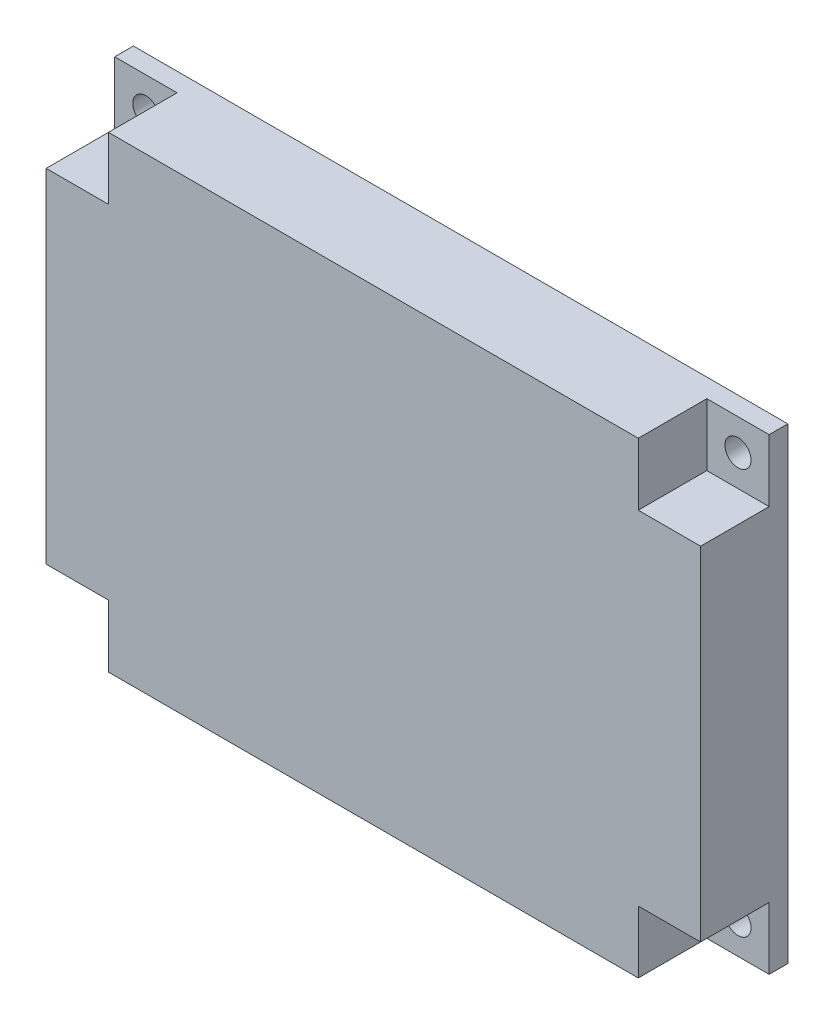
ISO-10303-21;
HEADER;
FILE_DESCRIPTION(('STEP AP214'),'2;1');
FILE_NAME('part.step','',(''),(''),'','','');
FILE_SCHEMA(('AUTOMOTIVE_DESIGN { 1 0 10303 214 1 1 1 1 }'));
ENDSEC;
DATA;
#1=APPLICATION_CONTEXT('core data for automotive mechanical design processes');
#2=APPLICATION_PROTOCOL_DEFINITION('international standard','automotive_design',2000,#1);
#3=PRODUCT_CONTEXT('',#1,'mechanical');
#4=PRODUCT('Part','Part','',(#3));
#5=PRODUCT_RELATED_PRODUCT_CATEGORY('part','',(#4));
#6=PRODUCT_DEFINITION_FORMATION('','',#4);
#7=PRODUCT_DEFINITION_CONTEXT('part definition',#1,'design');
#8=PRODUCT_DEFINITION('design','',#6,#7);
#9=PRODUCT_DEFINITION_SHAPE('','',#8);
#10=(LENGTH_UNIT() NAMED_UNIT(*) SI_UNIT(.MILLI.,.METRE.));
#11=(NAMED_UNIT(*) PLANE_ANGLE_UNIT() SI_UNIT($,.RADIAN.));
#12=(NAMED_UNIT(*) SI_UNIT($,.STERADIAN.) SOLID_ANGLE_UNIT());
#13=UNCERTAINTY_MEASURE_WITH_UNIT(LENGTH_MEASURE(1.E-05),#10,'distance_accuracy_value','');
#14=(GEOMETRIC_REPRESENTATION_CONTEXT(3) GLOBAL_UNCERTAINTY_ASSIGNED_CONTEXT((#13)) GLOBAL_UNIT_ASSIGNED_CONTEXT((#10,
#11,#12)) REPRESENTATION_CONTEXT('',''));
#15=CARTESIAN_POINT('',(0.,0.,0.));
#16=DIRECTION('',(0.,0.,1.));
#17=DIRECTION('',(1.,0.,0.));
#18=AXIS2_PLACEMENT_3D('',#15,#16,#17);
#19=CARTESIAN_POINT('',(-47.5,32.5,14.));
#20=DIRECTION('',(0.,0.,-1.));
#21=DIRECTION('',(-1.,0.,0.));
#22=AXIS2_PLACEMENT_3D('',#19,#20,#21);
#23=CYLINDRICAL_SURFACE('',#22,2.1);
#24=CARTESIAN_POINT('',(-47.5,32.5,0.));
#25=DIRECTION('',(0.,0.,1.));
#26=DIRECTION('',(-1.,0.,0.));
#27=AXIS2_PLACEMENT_3D('',#24,#25,#26);
#28=CIRCLE('',#27,2.1);
#29=CARTESIAN_POINT('',(-49.6,32.5,0.));
#30=VERTEX_POINT('',#29);
#31=EDGE_CURVE('E250',#30,#30,#28,.T.);
#32=ORIENTED_EDGE('',*,*,#31,.F.);
#33=EDGE_LOOP('',(#32));
#34=FACE_BOUND('',#33,.T.);
#35=CARTESIAN_POINT('',(-47.5,32.5,3.));
#36=DIRECTION('',(0.,0.,1.));
#37=DIRECTION('',(1.,0.,0.));
#38=AXIS2_PLACEMENT_3D('',#35,#36,#37);
#39=CIRCLE('',#38,2.1);
#40=CARTESIAN_POINT('',(-45.4,32.5,3.));
#41=VERTEX_POINT('',#40);
#42=EDGE_CURVE('E287',#41,#41,#39,.T.);
#43=ORIENTED_EDGE('',*,*,#42,.T.);
#44=EDGE_LOOP('',(#43));
#45=FACE_BOUND('',#44,.T.);
#46=ADVANCED_FACE('F32',(#34,#45),#23,.F.);
#47=CARTESIAN_POINT('',(-47.5,-32.5,14.));
#48=DIRECTION('',(0.,0.,-1.));
#49=DIRECTION('',(-1.,0.,0.));
#50=AXIS2_PLACEMENT_3D('',#47,#48,#49);
#51=CYLINDRICAL_SURFACE('',#50,2.1);
#52=CARTESIAN_POINT('',(-47.5,-32.5,0.));
#53=DIRECTION('',(0.,0.,1.));
#54=DIRECTION('',(1.,0.,0.));
#55=AXIS2_PLACEMENT_3D('',#52,#53,#54);
#56=CIRCLE('',#55,2.1);
#57=CARTESIAN_POINT('',(-45.4,-32.5,0.));
#58=VERTEX_POINT('',#57);
#59=EDGE_CURVE('E244',#58,#58,#56,.T.);
#60=ORIENTED_EDGE('',*,*,#59,.F.);
#61=EDGE_LOOP('',(#60));
#62=FACE_BOUND('',#61,.T.);
#63=CARTESIAN_POINT('',(-47.5,-32.5,3.));
#64=DIRECTION('',(0.,0.,1.));
#65=DIRECTION('',(1.,0.,0.));
#66=AXIS2_PLACEMENT_3D('',#63,#64,#65);
#67=CIRCLE('',#66,2.1);
#68=CARTESIAN_POINT('',(-45.4,-32.5,3.));
#69=VERTEX_POINT('',#68);
#70=EDGE_CURVE('E240',#69,#69,#67,.T.);
#71=ORIENTED_EDGE('',*,*,#70,.T.);
#72=EDGE_LOOP('',(#71));
#73=FACE_BOUND('',#72,.T.);
#74=ADVANCED_FACE('F316',(#62,#73),#51,.F.);
#75=CARTESIAN_POINT('',(0.,0.,14.));
#76=DIRECTION('',(0.,0.,1.));
#77=DIRECTION('',(1.,0.,0.));
#78=AXIS2_PLACEMENT_3D('',#75,#76,#77);
#79=PLANE('',#78);
#80=DIRECTION('',(-1.,0.,0.));
#81=VECTOR('',#80,1.);
#82=CARTESIAN_POINT('',(42.5,-27.5,14.));
#83=LINE('',#82,#81);
#84=CARTESIAN_POINT('',(52.5,-27.5,14.));
#85=VERTEX_POINT('',#84);
#86=CARTESIAN_POINT('',(42.5,-27.5,14.));
#87=VERTEX_POINT('',#86);
#88=EDGE_CURVE('E215',#85,#87,#83,.T.);
#89=ORIENTED_EDGE('',*,*,#88,.F.);
#90=DIRECTION('',(0.,1.,0.));
#91=VECTOR('',#90,1.);
#92=CARTESIAN_POINT('',(52.5,37.5,14.));
#93=LINE('',#92,#91);
#94=CARTESIAN_POINT('',(52.5,27.5,14.));
#95=VERTEX_POINT('',#94);
#96=EDGE_CURVE('E257',#85,#95,#93,.T.);
#97=ORIENTED_EDGE('',*,*,#96,.T.);
#98=DIRECTION('',(1.,0.,0.));
#99=VECTOR('',#98,1.);
#100=CARTESIAN_POINT('',(42.5,27.5,14.));
#101=LINE('',#100,#99);
#102=CARTESIAN_POINT('',(42.5,27.5,14.));
#103=VERTEX_POINT('',#102);
#104=EDGE_CURVE('E226',#103,#95,#101,.T.);
#105=ORIENTED_EDGE('',*,*,#104,.F.);
#106=DIRECTION('',(0.,-1.,0.));
#107=VECTOR('',#106,1.);
#108=CARTESIAN_POINT('',(42.5,27.5,14.));
#109=LINE('',#108,#107);
#110=CARTESIAN_POINT('',(42.5,37.5,14.));
#111=VERTEX_POINT('',#110);
#112=EDGE_CURVE('E179',#111,#103,#109,.T.);
#113=ORIENTED_EDGE('',*,*,#112,.F.);
#114=DIRECTION('',(-1.,0.,0.));
#115=VECTOR('',#114,1.);
#116=CARTESIAN_POINT('',(-52.5,37.5,14.));
#117=LINE('',#116,#115);
#118=CARTESIAN_POINT('',(-42.5,37.5,14.));
#119=VERTEX_POINT('',#118);
#120=EDGE_CURVE('E260',#111,#119,#117,.T.);
#121=ORIENTED_EDGE('',*,*,#120,.T.);
#122=DIRECTION('',(0.,1.,0.));
#123=VECTOR('',#122,1.);
#124=CARTESIAN_POINT('',(-42.5,27.5,14.));
#125=LINE('',#124,#123);
#126=CARTESIAN_POINT('',(-42.5,27.5,14.));
#127=VERTEX_POINT('',#126);
#128=EDGE_CURVE('E154',#127,#119,#125,.T.);
#129=ORIENTED_EDGE('',*,*,#128,.F.);
#130=DIRECTION('',(1.,0.,0.));
#131=VECTOR('',#130,1.);
#132=CARTESIAN_POINT('',(-42.5,27.5,14.));
#133=LINE('',#132,#131);
#134=CARTESIAN_POINT('',(-52.5,27.5,14.));
#135=VERTEX_POINT('',#134);
#136=EDGE_CURVE('E163',#135,#127,#133,.T.);
#137=ORIENTED_EDGE('',*,*,#136,.F.);
#138=DIRECTION('',(0.,-1.,0.));
#139=VECTOR('',#138,1.);
#140=CARTESIAN_POINT('',(-52.5,37.5,14.));
#141=LINE('',#140,#139);
#142=CARTESIAN_POINT('',(-52.5,-27.5,14.));
#143=VERTEX_POINT('',#142);
#144=EDGE_CURVE('E263',#135,#143,#141,.T.);
#145=ORIENTED_EDGE('',*,*,#144,.T.);
#146=DIRECTION('',(-1.,0.,0.));
#147=VECTOR('',#146,1.);
#148=CARTESIAN_POINT('',(-42.5,-27.5,14.));
#149=LINE('',#148,#147);
#150=CARTESIAN_POINT('',(-42.5,-27.5,14.));
#151=VERTEX_POINT('',#150);
#152=EDGE_CURVE('E193',#151,#143,#149,.T.);
#153=ORIENTED_EDGE('',*,*,#152,.F.);
#154=DIRECTION('',(0.,1.,0.));
#155=VECTOR('',#154,1.);
#156=CARTESIAN_POINT('',(-42.5,-27.5,14.));
#157=LINE('',#156,#155);
#158=CARTESIAN_POINT('',(-42.5,-37.5,14.));
#159=VERTEX_POINT('',#158);
#160=EDGE_CURVE('E185',#159,#151,#157,.T.);
#161=ORIENTED_EDGE('',*,*,#160,.F.);
#162=DIRECTION('',(1.,0.,0.));
#163=VECTOR('',#162,1.);
#164=CARTESIAN_POINT('',(-52.5,-37.5,14.));
#165=LINE('',#164,#163);
#166=CARTESIAN_POINT('',(42.5,-37.5,14.));
#167=VERTEX_POINT('',#166);
#168=EDGE_CURVE('E266',#159,#167,#165,.T.);
#169=ORIENTED_EDGE('',*,*,#168,.T.);
#170=DIRECTION('',(0.,-1.,0.));
#171=VECTOR('',#170,1.);
#172=CARTESIAN_POINT('',(42.5,-27.5,14.));
#173=LINE('',#172,#171);
#174=EDGE_CURVE('E207',#87,#167,#173,.T.);
#175=ORIENTED_EDGE('',*,*,#174,.F.);
#176=EDGE_LOOP('',(#89,#97,#105,#113,#121,#129,#137,#145,#153,#161,#169,#175));
#177=FACE_BOUND('',#176,.T.);
#178=ADVANCED_FACE('F307',(#177),#79,.T.);
#179=CARTESIAN_POINT('',(0.,0.,0.));
#180=DIRECTION('',(0.,0.,1.));
#181=DIRECTION('',(1.,0.,0.));
#182=AXIS2_PLACEMENT_3D('',#179,#180,#181);
#183=PLANE('',#182);
#184=DIRECTION('',(0.,1.,0.));
#185=VECTOR('',#184,1.);
#186=CARTESIAN_POINT('',(52.5,37.5,0.));
#187=LINE('',#186,#185);
#188=CARTESIAN_POINT('',(52.5,-37.5,0.));
#189=VERTEX_POINT('',#188);
#190=CARTESIAN_POINT('',(52.5,37.5,0.));
#191=VERTEX_POINT('',#190);
#192=EDGE_CURVE('E256',#189,#191,#187,.T.);
#193=ORIENTED_EDGE('',*,*,#192,.F.);
#194=DIRECTION('',(1.,0.,0.));
#195=VECTOR('',#194,1.);
#196=CARTESIAN_POINT('',(-52.5,-37.5,0.));
#197=LINE('',#196,#195);
#198=CARTESIAN_POINT('',(-52.5,-37.5,0.));
#199=VERTEX_POINT('',#198);
#200=EDGE_CURVE('E261',#199,#189,#197,.T.);
#201=ORIENTED_EDGE('',*,*,#200,.F.);
#202=DIRECTION('',(0.,-1.,0.));
#203=VECTOR('',#202,1.);
#204=CARTESIAN_POINT('',(-52.5,37.5,0.));
#205=LINE('',#204,#203);
#206=CARTESIAN_POINT('',(-52.5,37.5,0.));
#207=VERTEX_POINT('',#206);
#208=EDGE_CURVE('E274',#207,#199,#205,.T.);
#209=ORIENTED_EDGE('',*,*,#208,.F.);
#210=DIRECTION('',(-1.,0.,0.));
#211=VECTOR('',#210,1.);
#212=CARTESIAN_POINT('',(-52.5,37.5,0.));
#213=LINE('',#212,#211);
#214=EDGE_CURVE('E272',#191,#207,#213,.T.);
#215=ORIENTED_EDGE('',*,*,#214,.F.);
#216=EDGE_LOOP('',(#193,#201,#209,#215));
#217=FACE_BOUND('',#216,.T.);
#218=CARTESIAN_POINT('',(47.5,32.5,0.));
#219=DIRECTION('',(0.,0.,1.));
#220=DIRECTION('',(1.,0.,0.));
#221=AXIS2_PLACEMENT_3D('',#218,#219,#220);
#222=CIRCLE('',#221,2.1);
#223=CARTESIAN_POINT('',(49.6,32.5,0.));
#224=VERTEX_POINT('',#223);
#225=EDGE_CURVE('E253',#224,#224,#222,.T.);
#226=ORIENTED_EDGE('',*,*,#225,.T.);
#227=EDGE_LOOP('',(#226));
#228=FACE_BOUND('',#227,.T.);
#229=ORIENTED_EDGE('',*,*,#31,.T.);
#230=EDGE_LOOP('',(#229));
#231=FACE_BOUND('',#230,.T.);
#232=CARTESIAN_POINT('',(47.5,-32.5,0.));
#233=DIRECTION('',(0.,0.,1.));
#234=DIRECTION('',(-1.,0.,0.));
#235=AXIS2_PLACEMENT_3D('',#232,#233,#234);
#236=CIRCLE('',#235,2.1);
#237=CARTESIAN_POINT('',(45.4,-32.5,0.));
#238=VERTEX_POINT('',#237);
#239=EDGE_CURVE('E247',#238,#238,#236,.T.);
#240=ORIENTED_EDGE('',*,*,#239,.T.);
#241=EDGE_LOOP('',(#240));
#242=FACE_BOUND('',#241,.T.);
#243=ORIENTED_EDGE('',*,*,#59,.T.);
#244=EDGE_LOOP('',(#243));
#245=FACE_BOUND('',#244,.T.);
#246=ADVANCED_FACE('F304',(#217,#228,#231,#242,#245),#183,.F.);
#247=CARTESIAN_POINT('',(52.5,37.5,14.));
#248=DIRECTION('',(-1.,0.,0.));
#249=DIRECTION('',(0.,0.,1.));
#250=AXIS2_PLACEMENT_3D('',#247,#248,#249);
#251=PLANE('',#250);
#252=ORIENTED_EDGE('',*,*,#96,.F.);
#253=DIRECTION('',(0.,0.,1.));
#254=VECTOR('',#253,1.);
#255=CARTESIAN_POINT('',(52.5,-27.5,3.));
#256=LINE('',#255,#254);
#257=CARTESIAN_POINT('',(52.5,-27.5,3.));
#258=VERTEX_POINT('',#257);
#259=EDGE_CURVE('E195',#258,#85,#256,.T.);
#260=ORIENTED_EDGE('',*,*,#259,.F.);
#261=DIRECTION('',(0.,1.,0.));
#262=VECTOR('',#261,1.);
#263=CARTESIAN_POINT('',(52.5,-27.5,3.));
#264=LINE('',#263,#262);
#265=CARTESIAN_POINT('',(52.5,-37.5,3.));
#266=VERTEX_POINT('',#265);
#267=EDGE_CURVE('E211',#266,#258,#264,.T.);
#268=ORIENTED_EDGE('',*,*,#267,.F.);
#269=DIRECTION('',(0.,0.,-1.));
#270=VECTOR('',#269,1.);
#271=CARTESIAN_POINT('',(52.5,-37.5,14.));
#272=LINE('',#271,#270);
#273=EDGE_CURVE('E269',#266,#189,#272,.T.);
#274=ORIENTED_EDGE('',*,*,#273,.T.);
#275=ORIENTED_EDGE('',*,*,#192,.T.);
#276=DIRECTION('',(0.,0.,-1.));
#277=VECTOR('',#276,1.);
#278=CARTESIAN_POINT('',(52.5,37.5,14.));
#279=LINE('',#278,#277);
#280=CARTESIAN_POINT('',(52.5,37.5,3.));
#281=VERTEX_POINT('',#280);
#282=EDGE_CURVE('E11',#281,#191,#279,.T.);
#283=ORIENTED_EDGE('',*,*,#282,.F.);
#284=DIRECTION('',(0.,1.,0.));
#285=VECTOR('',#284,1.);
#286=CARTESIAN_POINT('',(52.5,27.5,3.));
#287=LINE('',#286,#285);
#288=CARTESIAN_POINT('',(52.5,27.5,3.));
#289=VERTEX_POINT('',#288);
#290=EDGE_CURVE('E49',#289,#281,#287,.T.);
#291=ORIENTED_EDGE('',*,*,#290,.F.);
#292=DIRECTION('',(0.,0.,1.));
#293=VECTOR('',#292,1.);
#294=CARTESIAN_POINT('',(52.5,27.5,3.));
#295=LINE('',#294,#293);
#296=EDGE_CURVE('E237',#289,#95,#295,.T.);
#297=ORIENTED_EDGE('',*,*,#296,.T.);
#298=EDGE_LOOP('',(#252,#260,#268,#274,#275,#283,#291,#297));
#299=FACE_BOUND('',#298,.T.);
#300=ADVANCED_FACE('F34',(#299),#251,.F.);
#301=CARTESIAN_POINT('',(-52.5,37.5,14.));
#302=DIRECTION('',(0.,-1.,0.));
#303=DIRECTION('',(0.,0.,-1.));
#304=AXIS2_PLACEMENT_3D('',#301,#302,#303);
#305=PLANE('',#304);
#306=DIRECTION('',(-1.,0.,0.));
#307=VECTOR('',#306,1.);
#308=CARTESIAN_POINT('',(-42.5,37.5,3.));
#309=LINE('',#308,#307);
#310=CARTESIAN_POINT('',(-42.5,37.5,3.));
#311=VERTEX_POINT('',#310);
#312=CARTESIAN_POINT('',(-52.5,37.5,3.));
#313=VERTEX_POINT('',#312);
#314=EDGE_CURVE('E57',#311,#313,#309,.T.);
#315=ORIENTED_EDGE('',*,*,#314,.F.);
#316=DIRECTION('',(0.,0.,1.));
#317=VECTOR('',#316,1.);
#318=CARTESIAN_POINT('',(-42.5,37.5,3.));
#319=LINE('',#318,#317);
#320=EDGE_CURVE('E149',#311,#119,#319,.T.);
#321=ORIENTED_EDGE('',*,*,#320,.T.);
#322=ORIENTED_EDGE('',*,*,#120,.F.);
#323=DIRECTION('',(0.,0.,1.));
#324=VECTOR('',#323,1.);
#325=CARTESIAN_POINT('',(42.5,37.5,3.));
#326=LINE('',#325,#324);
#327=CARTESIAN_POINT('',(42.5,37.5,3.));
#328=VERTEX_POINT('',#327);
#329=EDGE_CURVE('E233',#328,#111,#326,.T.);
#330=ORIENTED_EDGE('',*,*,#329,.F.);
#331=DIRECTION('',(-1.,0.,0.));
#332=VECTOR('',#331,1.);
#333=CARTESIAN_POINT('',(42.5,37.5,3.));
#334=LINE('',#333,#332);
#335=EDGE_CURVE('E225',#281,#328,#334,.T.);
#336=ORIENTED_EDGE('',*,*,#335,.F.);
#337=ORIENTED_EDGE('',*,*,#282,.T.);
#338=ORIENTED_EDGE('',*,*,#214,.T.);
#339=DIRECTION('',(0.,0.,-1.));
#340=VECTOR('',#339,1.);
#341=CARTESIAN_POINT('',(-52.5,37.5,14.));
#342=LINE('',#341,#340);
#343=EDGE_CURVE('E41',#313,#207,#342,.T.);
#344=ORIENTED_EDGE('',*,*,#343,.F.);
#345=EDGE_LOOP('',(#315,#321,#322,#330,#336,#337,#338,#344));
#346=FACE_BOUND('',#345,.T.);
#347=ADVANCED_FACE('F166',(#346),#305,.F.);
#348=CARTESIAN_POINT('',(-52.5,37.5,14.));
#349=DIRECTION('',(1.,0.,0.));
#350=DIRECTION('',(0.,0.,-1.));
#351=AXIS2_PLACEMENT_3D('',#348,#349,#350);
#352=PLANE('',#351);
#353=DIRECTION('',(0.,-1.,0.));
#354=VECTOR('',#353,1.);
#355=CARTESIAN_POINT('',(-52.5,-27.5,3.));
#356=LINE('',#355,#354);
#357=CARTESIAN_POINT('',(-52.5,-27.5,3.));
#358=VERTEX_POINT('',#357);
#359=CARTESIAN_POINT('',(-52.5,-37.5,3.));
#360=VERTEX_POINT('',#359);
#361=EDGE_CURVE('E184',#358,#360,#356,.T.);
#362=ORIENTED_EDGE('',*,*,#361,.F.);
#363=DIRECTION('',(0.,0.,1.));
#364=VECTOR('',#363,1.);
#365=CARTESIAN_POINT('',(-52.5,-27.5,3.));
#366=LINE('',#365,#364);
#367=EDGE_CURVE('E192',#358,#143,#366,.T.);
#368=ORIENTED_EDGE('',*,*,#367,.T.);
#369=ORIENTED_EDGE('',*,*,#144,.F.);
#370=DIRECTION('',(0.,0.,1.));
#371=VECTOR('',#370,1.);
#372=CARTESIAN_POINT('',(-52.5,27.5,3.));
#373=LINE('',#372,#371);
#374=CARTESIAN_POINT('',(-52.5,27.5,3.));
#375=VERTEX_POINT('',#374);
#376=EDGE_CURVE('E158',#375,#135,#373,.T.);
#377=ORIENTED_EDGE('',*,*,#376,.F.);
#378=DIRECTION('',(0.,-1.,0.));
#379=VECTOR('',#378,1.);
#380=CARTESIAN_POINT('',(-52.5,27.5,3.));
#381=LINE('',#380,#379);
#382=EDGE_CURVE('E168',#313,#375,#381,.T.);
#383=ORIENTED_EDGE('',*,*,#382,.F.);
#384=ORIENTED_EDGE('',*,*,#343,.T.);
#385=ORIENTED_EDGE('',*,*,#208,.T.);
#386=DIRECTION('',(0.,0.,-1.));
#387=VECTOR('',#386,1.);
#388=CARTESIAN_POINT('',(-52.5,-37.5,14.));
#389=LINE('',#388,#387);
#390=EDGE_CURVE('E280',#360,#199,#389,.T.);
#391=ORIENTED_EDGE('',*,*,#390,.F.);
#392=EDGE_LOOP('',(#362,#368,#369,#377,#383,#384,#385,#391));
#393=FACE_BOUND('',#392,.T.);
#394=ADVANCED_FACE('F335',(#393),#352,.F.);
#395=CARTESIAN_POINT('',(-52.5,-37.5,14.));
#396=DIRECTION('',(0.,1.,0.));
#397=DIRECTION('',(0.,0.,1.));
#398=AXIS2_PLACEMENT_3D('',#395,#396,#397);
#399=PLANE('',#398);
#400=DIRECTION('',(1.,0.,0.));
#401=VECTOR('',#400,1.);
#402=CARTESIAN_POINT('',(42.5,-37.5,3.));
#403=LINE('',#402,#401);
#404=CARTESIAN_POINT('',(42.5,-37.5,3.));
#405=VERTEX_POINT('',#404);
#406=EDGE_CURVE('E209',#405,#266,#403,.T.);
#407=ORIENTED_EDGE('',*,*,#406,.F.);
#408=DIRECTION('',(0.,0.,1.));
#409=VECTOR('',#408,1.);
#410=CARTESIAN_POINT('',(42.5,-37.5,3.));
#411=LINE('',#410,#409);
#412=EDGE_CURVE('E220',#405,#167,#411,.T.);
#413=ORIENTED_EDGE('',*,*,#412,.T.);
#414=ORIENTED_EDGE('',*,*,#168,.F.);
#415=DIRECTION('',(0.,0.,1.));
#416=VECTOR('',#415,1.);
#417=CARTESIAN_POINT('',(-42.5,-37.5,3.));
#418=LINE('',#417,#416);
#419=CARTESIAN_POINT('',(-42.5,-37.5,3.));
#420=VERTEX_POINT('',#419);
#421=EDGE_CURVE('E199',#420,#159,#418,.T.);
#422=ORIENTED_EDGE('',*,*,#421,.F.);
#423=DIRECTION('',(1.,0.,0.));
#424=VECTOR('',#423,1.);
#425=CARTESIAN_POINT('',(-42.5,-37.5,3.));
#426=LINE('',#425,#424);
#427=EDGE_CURVE('E187',#360,#420,#426,.T.);
#428=ORIENTED_EDGE('',*,*,#427,.F.);
#429=ORIENTED_EDGE('',*,*,#390,.T.);
#430=ORIENTED_EDGE('',*,*,#200,.T.);
#431=ORIENTED_EDGE('',*,*,#273,.F.);
#432=EDGE_LOOP('',(#407,#413,#414,#422,#428,#429,#430,#431));
#433=FACE_BOUND('',#432,.T.);
#434=ADVANCED_FACE('F300',(#433),#399,.F.);
#435=CARTESIAN_POINT('',(47.5,32.5,14.));
#436=DIRECTION('',(0.,0.,-1.));
#437=DIRECTION('',(-1.,0.,0.));
#438=AXIS2_PLACEMENT_3D('',#435,#436,#437);
#439=CYLINDRICAL_SURFACE('',#438,2.1);
#440=CARTESIAN_POINT('',(47.5,32.5,3.));
#441=DIRECTION('',(0.,0.,-1.));
#442=DIRECTION('',(-1.,0.,0.));
#443=AXIS2_PLACEMENT_3D('',#440,#441,#442);
#444=CIRCLE('',#443,2.1);
#445=CARTESIAN_POINT('',(45.4,32.5,3.));
#446=VERTEX_POINT('',#445);
#447=EDGE_CURVE('E36',#446,#446,#444,.T.);
#448=ORIENTED_EDGE('',*,*,#447,.F.);
#449=EDGE_LOOP('',(#448));
#450=FACE_BOUND('',#449,.T.);
#451=ORIENTED_EDGE('',*,*,#225,.F.);
#452=EDGE_LOOP('',(#451));
#453=FACE_BOUND('',#452,.T.);
#454=ADVANCED_FACE('F296',(#450,#453),#439,.F.);
#455=CARTESIAN_POINT('',(47.5,-32.5,14.));
#456=DIRECTION('',(0.,0.,-1.));
#457=DIRECTION('',(-1.,0.,0.));
#458=AXIS2_PLACEMENT_3D('',#455,#456,#457);
#459=CYLINDRICAL_SURFACE('',#458,2.1);
#460=CARTESIAN_POINT('',(47.5,-32.5,3.));
#461=DIRECTION('',(0.,0.,-1.));
#462=DIRECTION('',(-1.,0.,0.));
#463=AXIS2_PLACEMENT_3D('',#460,#461,#462);
#464=CIRCLE('',#463,2.1);
#465=CARTESIAN_POINT('',(45.4,-32.5,3.));
#466=VERTEX_POINT('',#465);
#467=EDGE_CURVE('E285',#466,#466,#464,.T.);
#468=ORIENTED_EDGE('',*,*,#467,.F.);
#469=EDGE_LOOP('',(#468));
#470=FACE_BOUND('',#469,.T.);
#471=ORIENTED_EDGE('',*,*,#239,.F.);
#472=EDGE_LOOP('',(#471));
#473=FACE_BOUND('',#472,.T.);
#474=ADVANCED_FACE('F299',(#470,#473),#459,.F.);
#475=CARTESIAN_POINT('',(-42.5,-27.5,3.));
#476=DIRECTION('',(0.,1.,0.));
#477=DIRECTION('',(0.,0.,1.));
#478=AXIS2_PLACEMENT_3D('',#475,#476,#477);
#479=PLANE('',#478);
#480=ORIENTED_EDGE('',*,*,#152,.T.);
#481=ORIENTED_EDGE('',*,*,#367,.F.);
#482=DIRECTION('',(-1.,0.,0.));
#483=VECTOR('',#482,1.);
#484=CARTESIAN_POINT('',(-42.5,-27.5,3.));
#485=LINE('',#484,#483);
#486=CARTESIAN_POINT('',(-42.5,-27.5,3.));
#487=VERTEX_POINT('',#486);
#488=EDGE_CURVE('E181',#487,#358,#485,.T.);
#489=ORIENTED_EDGE('',*,*,#488,.F.);
#490=DIRECTION('',(0.,0.,1.));
#491=VECTOR('',#490,1.);
#492=CARTESIAN_POINT('',(-42.5,-27.5,3.));
#493=LINE('',#492,#491);
#494=EDGE_CURVE('E174',#487,#151,#493,.T.);
#495=ORIENTED_EDGE('',*,*,#494,.T.);
#496=EDGE_LOOP('',(#480,#481,#489,#495));
#497=FACE_BOUND('',#496,.T.);
#498=ADVANCED_FACE('F348',(#497),#479,.F.);
#499=CARTESIAN_POINT('',(-42.5,-27.5,3.));
#500=DIRECTION('',(1.,0.,0.));
#501=DIRECTION('',(0.,0.,-1.));
#502=AXIS2_PLACEMENT_3D('',#499,#500,#501);
#503=PLANE('',#502);
#504=ORIENTED_EDGE('',*,*,#160,.T.);
#505=ORIENTED_EDGE('',*,*,#494,.F.);
#506=DIRECTION('',(0.,1.,0.));
#507=VECTOR('',#506,1.);
#508=CARTESIAN_POINT('',(-42.5,-27.5,3.));
#509=LINE('',#508,#507);
#510=EDGE_CURVE('E189',#420,#487,#509,.T.);
#511=ORIENTED_EDGE('',*,*,#510,.F.);
#512=ORIENTED_EDGE('',*,*,#421,.T.);
#513=EDGE_LOOP('',(#504,#505,#511,#512));
#514=FACE_BOUND('',#513,.T.);
#515=ADVANCED_FACE('F326',(#514),#503,.F.);
#516=CARTESIAN_POINT('',(0.,0.,3.));
#517=DIRECTION('',(0.,0.,1.));
#518=DIRECTION('',(1.,0.,0.));
#519=AXIS2_PLACEMENT_3D('',#516,#517,#518);
#520=PLANE('',#519);
#521=ORIENTED_EDGE('',*,*,#70,.F.);
#522=EDGE_LOOP('',(#521));
#523=FACE_BOUND('',#522,.T.);
#524=ORIENTED_EDGE('',*,*,#488,.T.);
#525=ORIENTED_EDGE('',*,*,#361,.T.);
#526=ORIENTED_EDGE('',*,*,#427,.T.);
#527=ORIENTED_EDGE('',*,*,#510,.T.);
#528=EDGE_LOOP('',(#524,#525,#526,#527));
#529=FACE_BOUND('',#528,.T.);
#530=ADVANCED_FACE('F322',(#523,#529),#520,.T.);
#531=CARTESIAN_POINT('',(42.5,-27.5,3.));
#532=DIRECTION('',(0.,1.,0.));
#533=DIRECTION('',(0.,0.,1.));
#534=AXIS2_PLACEMENT_3D('',#531,#532,#533);
#535=PLANE('',#534);
#536=ORIENTED_EDGE('',*,*,#88,.T.);
#537=DIRECTION('',(0.,0.,1.));
#538=VECTOR('',#537,1.);
#539=CARTESIAN_POINT('',(42.5,-27.5,3.));
#540=LINE('',#539,#538);
#541=CARTESIAN_POINT('',(42.5,-27.5,3.));
#542=VERTEX_POINT('',#541);
#543=EDGE_CURVE('E214',#542,#87,#540,.T.);
#544=ORIENTED_EDGE('',*,*,#543,.F.);
#545=DIRECTION('',(-1.,0.,0.));
#546=VECTOR('',#545,1.);
#547=CARTESIAN_POINT('',(42.5,-27.5,3.));
#548=LINE('',#547,#546);
#549=EDGE_CURVE('E203',#258,#542,#548,.T.);
#550=ORIENTED_EDGE('',*,*,#549,.F.);
#551=ORIENTED_EDGE('',*,*,#259,.T.);
#552=EDGE_LOOP('',(#536,#544,#550,#551));
#553=FACE_BOUND('',#552,.T.);
#554=ADVANCED_FACE('F325',(#553),#535,.F.);
#555=CARTESIAN_POINT('',(42.5,-27.5,3.));
#556=DIRECTION('',(-1.,0.,0.));
#557=DIRECTION('',(0.,0.,1.));
#558=AXIS2_PLACEMENT_3D('',#555,#556,#557);
#559=PLANE('',#558);
#560=ORIENTED_EDGE('',*,*,#174,.T.);
#561=ORIENTED_EDGE('',*,*,#412,.F.);
#562=DIRECTION('',(0.,-1.,0.));
#563=VECTOR('',#562,1.);
#564=CARTESIAN_POINT('',(42.5,-27.5,3.));
#565=LINE('',#564,#563);
#566=EDGE_CURVE('E206',#542,#405,#565,.T.);
#567=ORIENTED_EDGE('',*,*,#566,.F.);
#568=ORIENTED_EDGE('',*,*,#543,.T.);
#569=EDGE_LOOP('',(#560,#561,#567,#568));
#570=FACE_BOUND('',#569,.T.);
#571=ADVANCED_FACE('F400',(#570),#559,.F.);
#572=CARTESIAN_POINT('',(0.,0.,3.));
#573=DIRECTION('',(0.,0.,-1.));
#574=DIRECTION('',(-1.,0.,0.));
#575=AXIS2_PLACEMENT_3D('',#572,#573,#574);
#576=PLANE('',#575);
#577=ORIENTED_EDGE('',*,*,#467,.T.);
#578=EDGE_LOOP('',(#577));
#579=FACE_BOUND('',#578,.T.);
#580=ORIENTED_EDGE('',*,*,#549,.T.);
#581=ORIENTED_EDGE('',*,*,#566,.T.);
#582=ORIENTED_EDGE('',*,*,#406,.T.);
#583=ORIENTED_EDGE('',*,*,#267,.T.);
#584=EDGE_LOOP('',(#580,#581,#582,#583));
#585=FACE_BOUND('',#584,.T.);
#586=ADVANCED_FACE('F397',(#579,#585),#576,.F.);
#587=CARTESIAN_POINT('',(-42.5,27.5,3.));
#588=DIRECTION('',(1.,0.,0.));
#589=DIRECTION('',(0.,0.,-1.));
#590=AXIS2_PLACEMENT_3D('',#587,#588,#589);
#591=PLANE('',#590);
#592=ORIENTED_EDGE('',*,*,#128,.T.);
#593=ORIENTED_EDGE('',*,*,#320,.F.);
#594=DIRECTION('',(0.,1.,0.));
#595=VECTOR('',#594,1.);
#596=CARTESIAN_POINT('',(-42.5,27.5,3.));
#597=LINE('',#596,#595);
#598=CARTESIAN_POINT('',(-42.5,27.5,3.));
#599=VERTEX_POINT('',#598);
#600=EDGE_CURVE('E151',#599,#311,#597,.T.);
#601=ORIENTED_EDGE('',*,*,#600,.F.);
#602=DIRECTION('',(0.,0.,1.));
#603=VECTOR('',#602,1.);
#604=CARTESIAN_POINT('',(-42.5,27.5,3.));
#605=LINE('',#604,#603);
#606=EDGE_CURVE('E177',#599,#127,#605,.T.);
#607=ORIENTED_EDGE('',*,*,#606,.T.);
#608=EDGE_LOOP('',(#592,#593,#601,#607));
#609=FACE_BOUND('',#608,.T.);
#610=ADVANCED_FACE('F150',(#609),#591,.F.);
#611=CARTESIAN_POINT('',(-42.5,27.5,3.));
#612=DIRECTION('',(0.,-1.,0.));
#613=DIRECTION('',(0.,0.,-1.));
#614=AXIS2_PLACEMENT_3D('',#611,#612,#613);
#615=PLANE('',#614);
#616=ORIENTED_EDGE('',*,*,#136,.T.);
#617=ORIENTED_EDGE('',*,*,#606,.F.);
#618=DIRECTION('',(1.,0.,0.));
#619=VECTOR('',#618,1.);
#620=CARTESIAN_POINT('',(-42.5,27.5,3.));
#621=LINE('',#620,#619);
#622=EDGE_CURVE('E159',#375,#599,#621,.T.);
#623=ORIENTED_EDGE('',*,*,#622,.F.);
#624=ORIENTED_EDGE('',*,*,#376,.T.);
#625=EDGE_LOOP('',(#616,#617,#623,#624));
#626=FACE_BOUND('',#625,.T.);
#627=ADVANCED_FACE('F354',(#626),#615,.F.);
#628=CARTESIAN_POINT('',(0.,0.,3.));
#629=DIRECTION('',(0.,0.,1.));
#630=DIRECTION('',(1.,0.,0.));
#631=AXIS2_PLACEMENT_3D('',#628,#629,#630);
#632=PLANE('',#631);
#633=ORIENTED_EDGE('',*,*,#42,.F.);
#634=EDGE_LOOP('',(#633));
#635=FACE_BOUND('',#634,.T.);
#636=ORIENTED_EDGE('',*,*,#600,.T.);
#637=ORIENTED_EDGE('',*,*,#314,.T.);
#638=ORIENTED_EDGE('',*,*,#382,.T.);
#639=ORIENTED_EDGE('',*,*,#622,.T.);
#640=EDGE_LOOP('',(#636,#637,#638,#639));
#641=FACE_BOUND('',#640,.T.);
#642=ADVANCED_FACE('F161',(#635,#641),#632,.T.);
#643=CARTESIAN_POINT('',(42.5,27.5,3.));
#644=DIRECTION('',(0.,-1.,0.));
#645=DIRECTION('',(0.,0.,-1.));
#646=AXIS2_PLACEMENT_3D('',#643,#644,#645);
#647=PLANE('',#646);
#648=ORIENTED_EDGE('',*,*,#104,.T.);
#649=ORIENTED_EDGE('',*,*,#296,.F.);
#650=DIRECTION('',(1.,0.,0.));
#651=VECTOR('',#650,1.);
#652=CARTESIAN_POINT('',(42.5,27.5,3.));
#653=LINE('',#652,#651);
#654=CARTESIAN_POINT('',(42.5,27.5,3.));
#655=VERTEX_POINT('',#654);
#656=EDGE_CURVE('E231',#655,#289,#653,.T.);
#657=ORIENTED_EDGE('',*,*,#656,.F.);
#658=DIRECTION('',(0.,0.,1.));
#659=VECTOR('',#658,1.);
#660=CARTESIAN_POINT('',(42.5,27.5,3.));
#661=LINE('',#660,#659);
#662=EDGE_CURVE('E241',#655,#103,#661,.T.);
#663=ORIENTED_EDGE('',*,*,#662,.T.);
#664=EDGE_LOOP('',(#648,#649,#657,#663));
#665=FACE_BOUND('',#664,.T.);
#666=ADVANCED_FACE('F367',(#665),#647,.F.);
#667=CARTESIAN_POINT('',(42.5,27.5,3.));
#668=DIRECTION('',(-1.,0.,0.));
#669=DIRECTION('',(0.,0.,1.));
#670=AXIS2_PLACEMENT_3D('',#667,#668,#669);
#671=PLANE('',#670);
#672=ORIENTED_EDGE('',*,*,#112,.T.);
#673=ORIENTED_EDGE('',*,*,#662,.F.);
#674=DIRECTION('',(0.,-1.,0.));
#675=VECTOR('',#674,1.);
#676=CARTESIAN_POINT('',(42.5,27.5,3.));
#677=LINE('',#676,#675);
#678=EDGE_CURVE('E228',#328,#655,#677,.T.);
#679=ORIENTED_EDGE('',*,*,#678,.F.);
#680=ORIENTED_EDGE('',*,*,#329,.T.);
#681=EDGE_LOOP('',(#672,#673,#679,#680));
#682=FACE_BOUND('',#681,.T.);
#683=ADVANCED_FACE('F360',(#682),#671,.F.);
#684=CARTESIAN_POINT('',(0.,0.,3.));
#685=DIRECTION('',(0.,0.,-1.));
#686=DIRECTION('',(-1.,0.,0.));
#687=AXIS2_PLACEMENT_3D('',#684,#685,#686);
#688=PLANE('',#687);
#689=ORIENTED_EDGE('',*,*,#447,.T.);
#690=EDGE_LOOP('',(#689));
#691=FACE_BOUND('',#690,.T.);
#692=ORIENTED_EDGE('',*,*,#290,.T.);
#693=ORIENTED_EDGE('',*,*,#335,.T.);
#694=ORIENTED_EDGE('',*,*,#678,.T.);
#695=ORIENTED_EDGE('',*,*,#656,.T.);
#696=EDGE_LOOP('',(#692,#693,#694,#695));
#697=FACE_BOUND('',#696,.T.);
#698=ADVANCED_FACE('F294',(#691,#697),#688,.F.);
#699=CLOSED_SHELL('',(#46,#74,#178,#246,#300,#347,#394,#434,#454,#474,#498,#515,#530,#554,#571,
#586,#610,#627,#642,#666,#683,#698));
#700=MANIFOLD_SOLID_BREP('B2',#699);
#701=ADVANCED_BREP_SHAPE_REPRESENTATION('',(#18,#700),#14);
#702=SHAPE_DEFINITION_REPRESENTATION(#9,#701);
ENDSEC;
END-ISO-10303-21;
